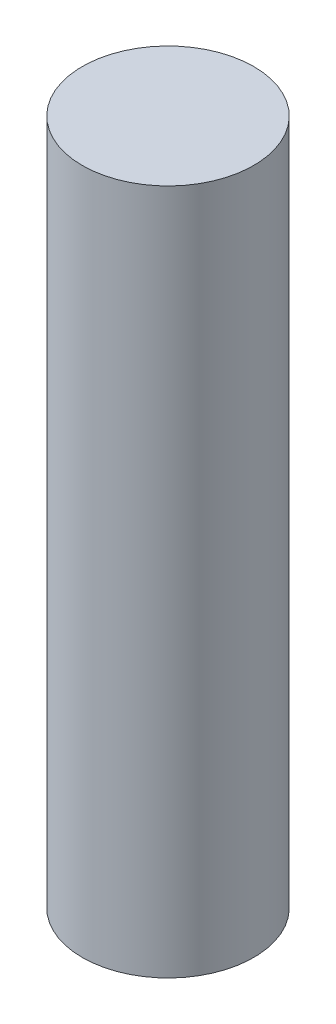
ISO-10303-21;
HEADER;
FILE_DESCRIPTION(('STEP AP214'),'2;1');
FILE_NAME('part.step','',(''),(''),'','','');
FILE_SCHEMA(('AUTOMOTIVE_DESIGN { 1 0 10303 214 1 1 1 1 }'));
ENDSEC;
DATA;
#1=APPLICATION_CONTEXT('core data for automotive mechanical design processes');
#2=APPLICATION_PROTOCOL_DEFINITION('international standard','automotive_design',2000,#1);
#3=PRODUCT_CONTEXT('',#1,'mechanical');
#4=PRODUCT('Part','Part','',(#3));
#5=PRODUCT_RELATED_PRODUCT_CATEGORY('part','',(#4));
#6=PRODUCT_DEFINITION_FORMATION('','',#4);
#7=PRODUCT_DEFINITION_CONTEXT('part definition',#1,'design');
#8=PRODUCT_DEFINITION('design','',#6,#7);
#9=PRODUCT_DEFINITION_SHAPE('','',#8);
#10=(LENGTH_UNIT() NAMED_UNIT(*) SI_UNIT(.MILLI.,.METRE.));
#11=(NAMED_UNIT(*) PLANE_ANGLE_UNIT() SI_UNIT($,.RADIAN.));
#12=(NAMED_UNIT(*) SI_UNIT($,.STERADIAN.) SOLID_ANGLE_UNIT());
#13=UNCERTAINTY_MEASURE_WITH_UNIT(LENGTH_MEASURE(1.E-05),#10,'distance_accuracy_value','');
#14=(GEOMETRIC_REPRESENTATION_CONTEXT(3) GLOBAL_UNCERTAINTY_ASSIGNED_CONTEXT((#13)) GLOBAL_UNIT_ASSIGNED_CONTEXT((#10,
#11,#12)) REPRESENTATION_CONTEXT('',''));
#15=CARTESIAN_POINT('',(0.,0.,0.));
#16=DIRECTION('',(0.,0.,1.));
#17=DIRECTION('',(1.,0.,0.));
#18=AXIS2_PLACEMENT_3D('',#15,#16,#17);
#19=CARTESIAN_POINT('',(0.,6.,0.));
#20=DIRECTION('',(0.,-1.,0.));
#21=DIRECTION('',(0.,0.,-1.));
#22=AXIS2_PLACEMENT_3D('',#19,#20,#21);
#23=CYLINDRICAL_SURFACE('',#22,0.75);
#24=CARTESIAN_POINT('',(0.,6.,0.));
#25=DIRECTION('',(0.,1.,0.));
#26=DIRECTION('',(0.,0.,1.));
#27=AXIS2_PLACEMENT_3D('',#24,#25,#26);
#28=CIRCLE('',#27,0.75);
#29=CARTESIAN_POINT('',(0.,6.,0.75));
#30=VERTEX_POINT('',#29);
#31=EDGE_CURVE('E10',#30,#30,#28,.T.);
#32=ORIENTED_EDGE('',*,*,#31,.F.);
#33=EDGE_LOOP('',(#32));
#34=FACE_BOUND('',#33,.T.);
#35=CARTESIAN_POINT('',(0.,0.,0.));
#36=DIRECTION('',(0.,1.,0.));
#37=DIRECTION('',(0.,0.,1.));
#38=AXIS2_PLACEMENT_3D('',#35,#36,#37);
#39=CIRCLE('',#38,0.75);
#40=CARTESIAN_POINT('',(0.,0.,0.75));
#41=VERTEX_POINT('',#40);
#42=EDGE_CURVE('E37',#41,#41,#39,.T.);
#43=ORIENTED_EDGE('',*,*,#42,.T.);
#44=EDGE_LOOP('',(#43));
#45=FACE_BOUND('',#44,.T.);
#46=ADVANCED_FACE('F34',(#34,#45),#23,.T.);
#47=CARTESIAN_POINT('',(0.,6.,0.));
#48=DIRECTION('',(0.,1.,0.));
#49=DIRECTION('',(0.,0.,1.));
#50=AXIS2_PLACEMENT_3D('',#47,#48,#49);
#51=PLANE('',#50);
#52=ORIENTED_EDGE('',*,*,#31,.T.);
#53=EDGE_LOOP('',(#52));
#54=FACE_BOUND('',#53,.T.);
#55=ADVANCED_FACE('F49',(#54),#51,.T.);
#56=CARTESIAN_POINT('',(0.,0.,0.));
#57=DIRECTION('',(0.,1.,0.));
#58=DIRECTION('',(0.,0.,1.));
#59=AXIS2_PLACEMENT_3D('',#56,#57,#58);
#60=PLANE('',#59);
#61=ORIENTED_EDGE('',*,*,#42,.F.);
#62=EDGE_LOOP('',(#61));
#63=FACE_BOUND('',#62,.T.);
#64=ADVANCED_FACE('F47',(#63),#60,.F.);
#65=CLOSED_SHELL('',(#46,#55,#64));
#66=MANIFOLD_SOLID_BREP('B2',#65);
#67=ADVANCED_BREP_SHAPE_REPRESENTATION('',(#18,#66),#14);
#68=SHAPE_DEFINITION_REPRESENTATION(#9,#67);
ENDSEC;
END-ISO-10303-21;
